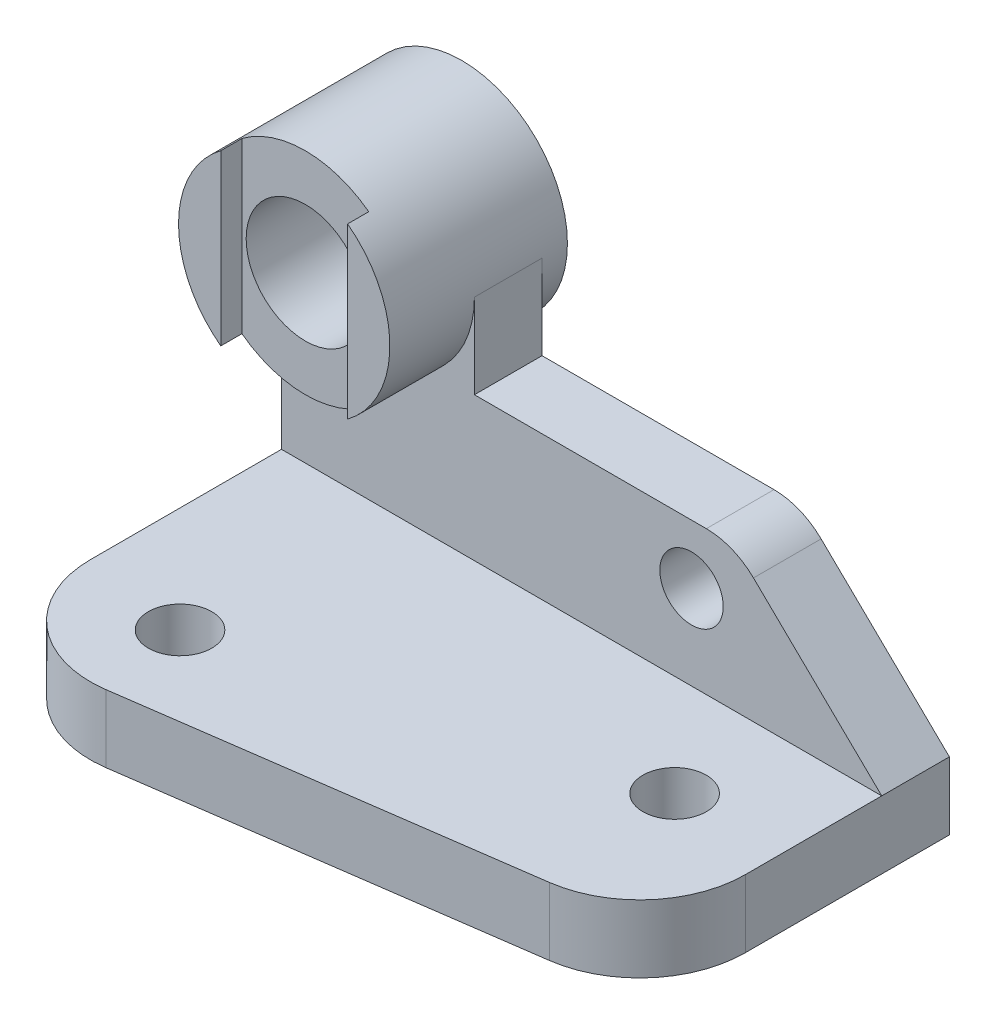
ISO-10303-21;
HEADER;
FILE_DESCRIPTION(('STEP AP214'),'2;1');
FILE_NAME('part.step','',(''),(''),'','','');
FILE_SCHEMA(('AUTOMOTIVE_DESIGN { 1 0 10303 214 1 1 1 1 }'));
ENDSEC;
DATA;
#1=APPLICATION_CONTEXT('core data for automotive mechanical design processes');
#2=APPLICATION_PROTOCOL_DEFINITION('international standard','automotive_design',2000,#1);
#3=PRODUCT_CONTEXT('',#1,'mechanical');
#4=PRODUCT('Part','Part','',(#3));
#5=PRODUCT_RELATED_PRODUCT_CATEGORY('part','',(#4));
#6=PRODUCT_DEFINITION_FORMATION('','',#4);
#7=PRODUCT_DEFINITION_CONTEXT('part definition',#1,'design');
#8=PRODUCT_DEFINITION('design','',#6,#7);
#9=PRODUCT_DEFINITION_SHAPE('','',#8);
#10=(LENGTH_UNIT() NAMED_UNIT(*) SI_UNIT(.MILLI.,.METRE.));
#11=(NAMED_UNIT(*) PLANE_ANGLE_UNIT() SI_UNIT($,.RADIAN.));
#12=(NAMED_UNIT(*) SI_UNIT($,.STERADIAN.) SOLID_ANGLE_UNIT());
#13=UNCERTAINTY_MEASURE_WITH_UNIT(LENGTH_MEASURE(1.E-05),#10,'distance_accuracy_value','');
#14=(GEOMETRIC_REPRESENTATION_CONTEXT(3) GLOBAL_UNCERTAINTY_ASSIGNED_CONTEXT((#13)) GLOBAL_UNIT_ASSIGNED_CONTEXT((#10,
#11,#12)) REPRESENTATION_CONTEXT('',''));
#15=CARTESIAN_POINT('',(0.,0.,0.));
#16=DIRECTION('',(0.,0.,1.));
#17=DIRECTION('',(1.,0.,0.));
#18=AXIS2_PLACEMENT_3D('',#15,#16,#17);
#19=CARTESIAN_POINT('',(20.64,70.,36.));
#20=DIRECTION('',(0.,0.,-1.));
#21=DIRECTION('',(-1.,0.,0.));
#22=AXIS2_PLACEMENT_3D('',#19,#20,#21);
#23=PLANE('',#22);
#24=CARTESIAN_POINT('',(20.64,70.,36.));
#25=DIRECTION('',(0.,0.,-1.));
#26=DIRECTION('',(-1.,0.,0.));
#27=AXIS2_PLACEMENT_3D('',#24,#25,#26);
#28=CIRCLE('',#27,25.);
#29=CARTESIAN_POINT('',(35.64,90.,36.));
#30=VERTEX_POINT('',#29);
#31=CARTESIAN_POINT('',(35.64,50.,36.));
#32=VERTEX_POINT('',#31);
#33=EDGE_CURVE('E162',#30,#32,#28,.T.);
#34=ORIENTED_EDGE('',*,*,#33,.F.);
#35=DIRECTION('',(0.,1.,0.));
#36=VECTOR('',#35,1.);
#37=CARTESIAN_POINT('',(35.64,100.,36.));
#38=LINE('',#37,#36);
#39=EDGE_CURVE('E150',#32,#30,#38,.T.);
#40=ORIENTED_EDGE('',*,*,#39,.F.);
#41=EDGE_LOOP('',(#34,#40));
#42=FACE_BOUND('',#41,.T.);
#43=ADVANCED_FACE('F35',(#42),#23,.F.);
#44=CARTESIAN_POINT('',(20.64,70.,36.));
#45=DIRECTION('',(0.,0.,-1.));
#46=DIRECTION('',(-1.,0.,0.));
#47=AXIS2_PLACEMENT_3D('',#44,#45,#46);
#48=CYLINDRICAL_SURFACE('',#47,14.);
#49=CARTESIAN_POINT('',(20.64,70.,-6.));
#50=DIRECTION('',(0.,0.,-1.));
#51=DIRECTION('',(-1.,0.,0.));
#52=AXIS2_PLACEMENT_3D('',#49,#50,#51);
#53=CIRCLE('',#52,14.);
#54=CARTESIAN_POINT('',(6.64,70.,-6.));
#55=VERTEX_POINT('',#54);
#56=EDGE_CURVE('E366',#55,#55,#53,.T.);
#57=ORIENTED_EDGE('',*,*,#56,.T.);
#58=EDGE_LOOP('',(#57));
#59=FACE_BOUND('',#58,.T.);
#60=CARTESIAN_POINT('',(20.64,70.,31.));
#61=DIRECTION('',(0.,0.,1.));
#62=DIRECTION('',(1.,0.,0.));
#63=AXIS2_PLACEMENT_3D('',#60,#61,#62);
#64=CIRCLE('',#63,14.);
#65=CARTESIAN_POINT('',(34.64,70.,31.));
#66=VERTEX_POINT('',#65);
#67=EDGE_CURVE('E39',#66,#66,#64,.F.);
#68=ORIENTED_EDGE('',*,*,#67,.F.);
#69=EDGE_LOOP('',(#68));
#70=FACE_BOUND('',#69,.T.);
#71=ADVANCED_FACE('F331',(#59,#70),#48,.F.);
#72=CARTESIAN_POINT('',(0.,16.,0.));
#73=DIRECTION('',(0.,-1.,0.));
#74=DIRECTION('',(0.,0.,-1.));
#75=AXIS2_PLACEMENT_3D('',#72,#73,#74);
#76=PLANE('',#75);
#77=CARTESIAN_POINT('',(25.,16.,65.));
#78=DIRECTION('',(0.,1.,0.));
#79=DIRECTION('',(0.,0.,1.));
#80=AXIS2_PLACEMENT_3D('',#77,#78,#79);
#81=CIRCLE('',#80,7.5);
#82=CARTESIAN_POINT('',(25.,16.,72.5));
#83=VERTEX_POINT('',#82);
#84=EDGE_CURVE('E223',#83,#83,#81,.T.);
#85=ORIENTED_EDGE('',*,*,#84,.F.);
#86=EDGE_LOOP('',(#85));
#87=FACE_BOUND('',#86,.T.);
#88=CARTESIAN_POINT('',(117.,16.,40.));
#89=DIRECTION('',(0.,1.,0.));
#90=DIRECTION('',(0.,0.,1.));
#91=AXIS2_PLACEMENT_3D('',#88,#89,#90);
#92=CIRCLE('',#91,7.50000000000001);
#93=CARTESIAN_POINT('',(117.,16.,47.5));
#94=VERTEX_POINT('',#93);
#95=EDGE_CURVE('E219',#94,#94,#92,.T.);
#96=ORIENTED_EDGE('',*,*,#95,.F.);
#97=EDGE_LOOP('',(#96));
#98=FACE_BOUND('',#97,.T.);
#99=DIRECTION('',(1.,0.,0.));
#100=VECTOR('',#99,1.);
#101=CARTESIAN_POINT('',(142.,16.,16.));
#102=LINE('',#101,#100);
#103=CARTESIAN_POINT('',(0.,16.,16.));
#104=VERTEX_POINT('',#103);
#105=CARTESIAN_POINT('',(142.,16.,16.));
#106=VERTEX_POINT('',#105);
#107=EDGE_CURVE('E59',#104,#106,#102,.T.);
#108=ORIENTED_EDGE('',*,*,#107,.F.);
#109=DIRECTION('',(0.,0.,1.));
#110=VECTOR('',#109,1.);
#111=CARTESIAN_POINT('',(0.,16.,90.));
#112=LINE('',#111,#110);
#113=CARTESIAN_POINT('',(0.,16.,61.2321242672629));
#114=VERTEX_POINT('',#113);
#115=EDGE_CURVE('E232',#104,#114,#112,.T.);
#116=ORIENTED_EDGE('',*,*,#115,.T.);
#117=CARTESIAN_POINT('',(25.,16.,61.2321242672629));
#118=DIRECTION('',(0.,-1.,0.));
#119=DIRECTION('',(0.,0.,-1.));
#120=AXIS2_PLACEMENT_3D('',#117,#118,#119);
#121=CIRCLE('',#120,25.);
#122=CARTESIAN_POINT('',(28.4867130461473,16.,85.9877868949088));
#123=VERTEX_POINT('',#122);
#124=EDGE_CURVE('E266',#114,#123,#121,.F.);
#125=ORIENTED_EDGE('',*,*,#124,.T.);
#126=DIRECTION('',(0.990226505105838,0.,-0.139468521845893));
#127=VECTOR('',#126,1.);
#128=CARTESIAN_POINT('',(142.,16.,70.));
#129=LINE('',#128,#127);
#130=CARTESIAN_POINT('',(120.486713046147,16.,73.0300404160356));
#131=VERTEX_POINT('',#130);
#132=EDGE_CURVE('E234',#123,#131,#129,.T.);
#133=ORIENTED_EDGE('',*,*,#132,.T.);
#134=CARTESIAN_POINT('',(117.,16.,48.2743777883896));
#135=DIRECTION('',(0.,-1.,0.));
#136=DIRECTION('',(0.,0.,-1.));
#137=AXIS2_PLACEMENT_3D('',#134,#135,#136);
#138=CIRCLE('',#137,25.);
#139=CARTESIAN_POINT('',(142.,16.,48.2743777883896));
#140=VERTEX_POINT('',#139);
#141=EDGE_CURVE('E44',#131,#140,#138,.F.);
#142=ORIENTED_EDGE('',*,*,#141,.T.);
#143=DIRECTION('',(0.,0.,-1.));
#144=VECTOR('',#143,1.);
#145=CARTESIAN_POINT('',(142.,16.,0.));
#146=LINE('',#145,#144);
#147=EDGE_CURVE('E238',#140,#106,#146,.T.);
#148=ORIENTED_EDGE('',*,*,#147,.T.);
#149=EDGE_LOOP('',(#108,#116,#125,#133,#142,#148));
#150=FACE_BOUND('',#149,.T.);
#151=ADVANCED_FACE('F270',(#87,#98,#150),#76,.F.);
#152=CARTESIAN_POINT('',(0.,16.,90.));
#153=DIRECTION('',(1.,0.,0.));
#154=DIRECTION('',(0.,0.,-1.));
#155=AXIS2_PLACEMENT_3D('',#152,#153,#154);
#156=PLANE('',#155);
#157=DIRECTION('',(0.,0.,1.));
#158=VECTOR('',#157,1.);
#159=CARTESIAN_POINT('',(0.,0.,90.));
#160=LINE('',#159,#158);
#161=CARTESIAN_POINT('',(0.,0.,0.));
#162=VERTEX_POINT('',#161);
#163=CARTESIAN_POINT('',(0.,0.,61.2321242672629));
#164=VERTEX_POINT('',#163);
#165=EDGE_CURVE('E229',#162,#164,#160,.T.);
#166=ORIENTED_EDGE('',*,*,#165,.T.);
#167=DIRECTION('',(0.,-1.,0.));
#168=VECTOR('',#167,1.);
#169=CARTESIAN_POINT('',(0.,16.,61.2321242672629));
#170=LINE('',#169,#168);
#171=EDGE_CURVE('E11',#164,#114,#170,.F.);
#172=ORIENTED_EDGE('',*,*,#171,.T.);
#173=ORIENTED_EDGE('',*,*,#115,.F.);
#174=DIRECTION('',(0.,-1.,0.));
#175=VECTOR('',#174,1.);
#176=CARTESIAN_POINT('',(0.,16.,16.));
#177=LINE('',#176,#175);
#178=CARTESIAN_POINT('',(0.,55.8936042874163,16.));
#179=VERTEX_POINT('',#178);
#180=EDGE_CURVE('E192',#179,#104,#177,.T.);
#181=ORIENTED_EDGE('',*,*,#180,.F.);
#182=DIRECTION('',(0.,0.,-1.));
#183=VECTOR('',#182,1.);
#184=CARTESIAN_POINT('',(0.,55.8936042874163,16.));
#185=LINE('',#184,#183);
#186=CARTESIAN_POINT('',(0.,55.8936042874163,0.));
#187=VERTEX_POINT('',#186);
#188=EDGE_CURVE('E194',#179,#187,#185,.T.);
#189=ORIENTED_EDGE('',*,*,#188,.T.);
#190=DIRECTION('',(0.,-1.,0.));
#191=VECTOR('',#190,1.);
#192=CARTESIAN_POINT('',(0.,16.,0.));
#193=LINE('',#192,#191);
#194=EDGE_CURVE('E240',#187,#162,#193,.T.);
#195=ORIENTED_EDGE('',*,*,#194,.T.);
#196=EDGE_LOOP('',(#166,#172,#173,#181,#189,#195));
#197=FACE_BOUND('',#196,.T.);
#198=ADVANCED_FACE('F293',(#197),#156,.F.);
#199=CARTESIAN_POINT('',(142.,16.,70.));
#200=DIRECTION('',(-0.139468521845893,0.,-0.990226505105838));
#201=DIRECTION('',(-0.990226505105838,0.,0.139468521845893));
#202=AXIS2_PLACEMENT_3D('',#199,#200,#201);
#203=PLANE('',#202);
#204=DIRECTION('',(0.990226505105838,0.,-0.139468521845893));
#205=VECTOR('',#204,1.);
#206=CARTESIAN_POINT('',(142.,0.,70.));
#207=LINE('',#206,#205);
#208=CARTESIAN_POINT('',(28.4867130461473,0.,85.9877868949088));
#209=VERTEX_POINT('',#208);
#210=CARTESIAN_POINT('',(120.486713046147,0.,73.0300404160356));
#211=VERTEX_POINT('',#210);
#212=EDGE_CURVE('E243',#209,#211,#207,.T.);
#213=ORIENTED_EDGE('',*,*,#212,.T.);
#214=DIRECTION('',(0.,-1.,0.));
#215=VECTOR('',#214,1.);
#216=CARTESIAN_POINT('',(120.486713046147,16.,73.0300404160356));
#217=LINE('',#216,#215);
#218=EDGE_CURVE('E264',#211,#131,#217,.F.);
#219=ORIENTED_EDGE('',*,*,#218,.T.);
#220=ORIENTED_EDGE('',*,*,#132,.F.);
#221=DIRECTION('',(0.,-1.,0.));
#222=VECTOR('',#221,1.);
#223=CARTESIAN_POINT('',(28.4867130461473,16.,85.9877868949088));
#224=LINE('',#223,#222);
#225=EDGE_CURVE('E261',#123,#209,#224,.T.);
#226=ORIENTED_EDGE('',*,*,#225,.T.);
#227=EDGE_LOOP('',(#213,#219,#220,#226));
#228=FACE_BOUND('',#227,.T.);
#229=ADVANCED_FACE('F286',(#228),#203,.F.);
#230=CARTESIAN_POINT('',(142.,16.,0.));
#231=DIRECTION('',(-1.,0.,0.));
#232=DIRECTION('',(0.,0.,1.));
#233=AXIS2_PLACEMENT_3D('',#230,#231,#232);
#234=PLANE('',#233);
#235=ORIENTED_EDGE('',*,*,#147,.F.);
#236=DIRECTION('',(0.,-1.,0.));
#237=VECTOR('',#236,1.);
#238=CARTESIAN_POINT('',(142.,16.,48.2743777883896));
#239=LINE('',#238,#237);
#240=CARTESIAN_POINT('',(142.,0.,48.2743777883896));
#241=VERTEX_POINT('',#240);
#242=EDGE_CURVE('E254',#140,#241,#239,.T.);
#243=ORIENTED_EDGE('',*,*,#242,.T.);
#244=DIRECTION('',(0.,0.,-1.));
#245=VECTOR('',#244,1.);
#246=CARTESIAN_POINT('',(142.,0.,0.));
#247=LINE('',#246,#245);
#248=CARTESIAN_POINT('',(142.,0.,0.));
#249=VERTEX_POINT('',#248);
#250=EDGE_CURVE('E246',#241,#249,#247,.T.);
#251=ORIENTED_EDGE('',*,*,#250,.T.);
#252=DIRECTION('',(0.,-1.,0.));
#253=VECTOR('',#252,1.);
#254=CARTESIAN_POINT('',(142.,16.,0.));
#255=LINE('',#254,#253);
#256=CARTESIAN_POINT('',(142.,16.,0.));
#257=VERTEX_POINT('',#256);
#258=EDGE_CURVE('E251',#257,#249,#255,.T.);
#259=ORIENTED_EDGE('',*,*,#258,.F.);
#260=DIRECTION('',(0.,0.,-1.));
#261=VECTOR('',#260,1.);
#262=CARTESIAN_POINT('',(142.,16.,16.));
#263=LINE('',#262,#261);
#264=EDGE_CURVE('E216',#106,#257,#263,.T.);
#265=ORIENTED_EDGE('',*,*,#264,.F.);
#266=EDGE_LOOP('',(#235,#243,#251,#259,#265));
#267=FACE_BOUND('',#266,.T.);
#268=ADVANCED_FACE('F277',(#267),#234,.F.);
#269=CARTESIAN_POINT('',(0.,16.,0.));
#270=DIRECTION('',(0.,0.,1.));
#271=DIRECTION('',(1.,0.,0.));
#272=AXIS2_PLACEMENT_3D('',#269,#270,#271);
#273=PLANE('',#272);
#274=CARTESIAN_POINT('',(97.,36.,0.));
#275=DIRECTION('',(0.,0.,1.));
#276=DIRECTION('',(1.,0.,0.));
#277=AXIS2_PLACEMENT_3D('',#274,#275,#276);
#278=CIRCLE('',#277,7.5);
#279=CARTESIAN_POINT('',(104.5,36.,0.));
#280=VERTEX_POINT('',#279);
#281=EDGE_CURVE('E364',#280,#280,#278,.T.);
#282=ORIENTED_EDGE('',*,*,#281,.T.);
#283=EDGE_LOOP('',(#282));
#284=FACE_BOUND('',#283,.T.);
#285=DIRECTION('',(-1.,0.,0.));
#286=VECTOR('',#285,1.);
#287=CARTESIAN_POINT('',(0.,0.,0.));
#288=LINE('',#287,#286);
#289=EDGE_CURVE('E235',#249,#162,#288,.T.);
#290=ORIENTED_EDGE('',*,*,#289,.T.);
#291=ORIENTED_EDGE('',*,*,#194,.F.);
#292=CARTESIAN_POINT('',(20.64,70.,0.));
#293=DIRECTION('',(0.,0.,-1.));
#294=DIRECTION('',(1.,0.,0.));
#295=AXIS2_PLACEMENT_3D('',#292,#293,#294);
#296=CIRCLE('',#295,25.);
#297=CARTESIAN_POINT('',(45.64,70.,0.));
#298=VERTEX_POINT('',#297);
#299=EDGE_CURVE('E180',#298,#187,#296,.T.);
#300=ORIENTED_EDGE('',*,*,#299,.F.);
#301=DIRECTION('',(0.,1.,0.));
#302=VECTOR('',#301,1.);
#303=CARTESIAN_POINT('',(45.64,50.,0.));
#304=LINE('',#303,#302);
#305=CARTESIAN_POINT('',(45.64,50.,0.));
#306=VERTEX_POINT('',#305);
#307=EDGE_CURVE('E199',#306,#298,#304,.T.);
#308=ORIENTED_EDGE('',*,*,#307,.F.);
#309=DIRECTION('',(-1.,0.,0.));
#310=VECTOR('',#309,1.);
#311=CARTESIAN_POINT('',(100.508003955283,50.,0.));
#312=LINE('',#311,#310);
#313=CARTESIAN_POINT('',(100.508003955283,50.,0.));
#314=VERTEX_POINT('',#313);
#315=EDGE_CURVE('E197',#314,#306,#312,.T.);
#316=ORIENTED_EDGE('',*,*,#315,.F.);
#317=CARTESIAN_POINT('',(100.508003955283,34.,0.));
#318=DIRECTION('',(0.,0.,1.));
#319=DIRECTION('',(1.,0.,0.));
#320=AXIS2_PLACEMENT_3D('',#317,#318,#319);
#321=CIRCLE('',#320,16.);
#322=CARTESIAN_POINT('',(111.656574903495,45.4764700937476,0.));
#323=VERTEX_POINT('',#322);
#324=EDGE_CURVE('E171',#323,#314,#321,.T.);
#325=ORIENTED_EDGE('',*,*,#324,.F.);
#326=DIRECTION('',(-0.717279380859227,0.696785684263249,0.));
#327=VECTOR('',#326,1.);
#328=CARTESIAN_POINT('',(142.,16.,0.));
#329=LINE('',#328,#327);
#330=EDGE_CURVE('E168',#257,#323,#329,.T.);
#331=ORIENTED_EDGE('',*,*,#330,.F.);
#332=ORIENTED_EDGE('',*,*,#258,.T.);
#333=EDGE_LOOP('',(#290,#291,#300,#308,#316,#325,#331,#332));
#334=FACE_BOUND('',#333,.T.);
#335=ADVANCED_FACE('F298',(#284,#334),#273,.F.);
#336=CARTESIAN_POINT('',(0.,0.,0.));
#337=DIRECTION('',(0.,-1.,0.));
#338=DIRECTION('',(0.,0.,-1.));
#339=AXIS2_PLACEMENT_3D('',#336,#337,#338);
#340=PLANE('',#339);
#341=CARTESIAN_POINT('',(117.,0.,40.));
#342=DIRECTION('',(0.,1.,0.));
#343=DIRECTION('',(0.,0.,1.));
#344=AXIS2_PLACEMENT_3D('',#341,#342,#343);
#345=CIRCLE('',#344,7.50000000000001);
#346=CARTESIAN_POINT('',(117.,0.,47.5));
#347=VERTEX_POINT('',#346);
#348=EDGE_CURVE('E220',#347,#347,#345,.T.);
#349=ORIENTED_EDGE('',*,*,#348,.T.);
#350=EDGE_LOOP('',(#349));
#351=FACE_BOUND('',#350,.T.);
#352=CARTESIAN_POINT('',(25.,0.,65.));
#353=DIRECTION('',(0.,1.,0.));
#354=DIRECTION('',(0.,0.,1.));
#355=AXIS2_PLACEMENT_3D('',#352,#353,#354);
#356=CIRCLE('',#355,7.5);
#357=CARTESIAN_POINT('',(25.,0.,72.5));
#358=VERTEX_POINT('',#357);
#359=EDGE_CURVE('E226',#358,#358,#356,.T.);
#360=ORIENTED_EDGE('',*,*,#359,.T.);
#361=EDGE_LOOP('',(#360));
#362=FACE_BOUND('',#361,.T.);
#363=ORIENTED_EDGE('',*,*,#250,.F.);
#364=CARTESIAN_POINT('',(117.,0.,48.2743777883896));
#365=DIRECTION('',(0.,-1.,0.));
#366=DIRECTION('',(0.,0.,-1.));
#367=AXIS2_PLACEMENT_3D('',#364,#365,#366);
#368=CIRCLE('',#367,25.);
#369=EDGE_CURVE('E259',#241,#211,#368,.T.);
#370=ORIENTED_EDGE('',*,*,#369,.T.);
#371=ORIENTED_EDGE('',*,*,#212,.F.);
#372=CARTESIAN_POINT('',(25.,0.,61.2321242672629));
#373=DIRECTION('',(0.,-1.,0.));
#374=DIRECTION('',(0.,0.,-1.));
#375=AXIS2_PLACEMENT_3D('',#372,#373,#374);
#376=CIRCLE('',#375,25.);
#377=EDGE_CURVE('E257',#209,#164,#376,.T.);
#378=ORIENTED_EDGE('',*,*,#377,.T.);
#379=ORIENTED_EDGE('',*,*,#165,.F.);
#380=ORIENTED_EDGE('',*,*,#289,.F.);
#381=EDGE_LOOP('',(#363,#370,#371,#378,#379,#380));
#382=FACE_BOUND('',#381,.T.);
#383=ADVANCED_FACE('F283',(#351,#362,#382),#340,.T.);
#384=CARTESIAN_POINT('',(117.,16.,48.2743777883896));
#385=DIRECTION('',(0.,-1.,0.));
#386=DIRECTION('',(0.,0.,-1.));
#387=AXIS2_PLACEMENT_3D('',#384,#385,#386);
#388=CYLINDRICAL_SURFACE('',#387,25.);
#389=ORIENTED_EDGE('',*,*,#141,.F.);
#390=ORIENTED_EDGE('',*,*,#218,.F.);
#391=ORIENTED_EDGE('',*,*,#369,.F.);
#392=ORIENTED_EDGE('',*,*,#242,.F.);
#393=EDGE_LOOP('',(#389,#390,#391,#392));
#394=FACE_BOUND('',#393,.T.);
#395=ADVANCED_FACE('F280',(#394),#388,.T.);
#396=CARTESIAN_POINT('',(25.,16.,61.2321242672629));
#397=DIRECTION('',(0.,-1.,0.));
#398=DIRECTION('',(0.,0.,-1.));
#399=AXIS2_PLACEMENT_3D('',#396,#397,#398);
#400=CYLINDRICAL_SURFACE('',#399,25.);
#401=ORIENTED_EDGE('',*,*,#124,.F.);
#402=ORIENTED_EDGE('',*,*,#171,.F.);
#403=ORIENTED_EDGE('',*,*,#377,.F.);
#404=ORIENTED_EDGE('',*,*,#225,.F.);
#405=EDGE_LOOP('',(#401,#402,#403,#404));
#406=FACE_BOUND('',#405,.T.);
#407=ADVANCED_FACE('F37',(#406),#400,.T.);
#408=CARTESIAN_POINT('',(25.,0.,65.));
#409=DIRECTION('',(0.,1.,0.));
#410=DIRECTION('',(0.,0.,1.));
#411=AXIS2_PLACEMENT_3D('',#408,#409,#410);
#412=CYLINDRICAL_SURFACE('',#411,7.5);
#413=ORIENTED_EDGE('',*,*,#359,.F.);
#414=EDGE_LOOP('',(#413));
#415=FACE_BOUND('',#414,.T.);
#416=ORIENTED_EDGE('',*,*,#84,.T.);
#417=EDGE_LOOP('',(#416));
#418=FACE_BOUND('',#417,.T.);
#419=ADVANCED_FACE('F417',(#415,#418),#412,.F.);
#420=CARTESIAN_POINT('',(117.,0.,40.));
#421=DIRECTION('',(0.,1.,0.));
#422=DIRECTION('',(0.,0.,1.));
#423=AXIS2_PLACEMENT_3D('',#420,#421,#422);
#424=CYLINDRICAL_SURFACE('',#423,7.50000000000001);
#425=ORIENTED_EDGE('',*,*,#348,.F.);
#426=EDGE_LOOP('',(#425));
#427=FACE_BOUND('',#426,.T.);
#428=ORIENTED_EDGE('',*,*,#95,.T.);
#429=EDGE_LOOP('',(#428));
#430=FACE_BOUND('',#429,.T.);
#431=ADVANCED_FACE('F328',(#427,#430),#424,.F.);
#432=CARTESIAN_POINT('',(142.,16.,16.));
#433=DIRECTION('',(-0.696785684263249,-0.717279380859227,0.));
#434=DIRECTION('',(0.717279380859227,-0.696785684263249,0.));
#435=AXIS2_PLACEMENT_3D('',#432,#433,#434);
#436=PLANE('',#435);
#437=ORIENTED_EDGE('',*,*,#330,.T.);
#438=DIRECTION('',(0.,0.,-1.));
#439=VECTOR('',#438,1.);
#440=CARTESIAN_POINT('',(111.656574903495,45.4764700937476,16.));
#441=LINE('',#440,#439);
#442=CARTESIAN_POINT('',(111.656574903495,45.4764700937476,16.));
#443=VERTEX_POINT('',#442);
#444=EDGE_CURVE('E213',#443,#323,#441,.T.);
#445=ORIENTED_EDGE('',*,*,#444,.F.);
#446=DIRECTION('',(-0.717279380859227,0.696785684263249,0.));
#447=VECTOR('',#446,1.);
#448=CARTESIAN_POINT('',(142.,16.,16.));
#449=LINE('',#448,#447);
#450=EDGE_CURVE('E179',#106,#443,#449,.T.);
#451=ORIENTED_EDGE('',*,*,#450,.F.);
#452=ORIENTED_EDGE('',*,*,#264,.T.);
#453=EDGE_LOOP('',(#437,#445,#451,#452));
#454=FACE_BOUND('',#453,.T.);
#455=ADVANCED_FACE('F305',(#454),#436,.F.);
#456=CARTESIAN_POINT('',(100.508003955283,34.,16.));
#457=DIRECTION('',(0.,0.,-1.));
#458=DIRECTION('',(-1.,0.,0.));
#459=AXIS2_PLACEMENT_3D('',#456,#457,#458);
#460=CYLINDRICAL_SURFACE('',#459,16.);
#461=ORIENTED_EDGE('',*,*,#324,.T.);
#462=DIRECTION('',(0.,0.,-1.));
#463=VECTOR('',#462,1.);
#464=CARTESIAN_POINT('',(100.508003955283,50.,16.));
#465=LINE('',#464,#463);
#466=CARTESIAN_POINT('',(100.508003955283,50.,16.));
#467=VERTEX_POINT('',#466);
#468=EDGE_CURVE('E210',#467,#314,#465,.T.);
#469=ORIENTED_EDGE('',*,*,#468,.F.);
#470=CARTESIAN_POINT('',(100.508003955283,34.,16.));
#471=DIRECTION('',(0.,0.,1.));
#472=DIRECTION('',(1.,0.,0.));
#473=AXIS2_PLACEMENT_3D('',#470,#471,#472);
#474=CIRCLE('',#473,16.);
#475=EDGE_CURVE('E182',#443,#467,#474,.T.);
#476=ORIENTED_EDGE('',*,*,#475,.F.);
#477=ORIENTED_EDGE('',*,*,#444,.T.);
#478=EDGE_LOOP('',(#461,#469,#476,#477));
#479=FACE_BOUND('',#478,.T.);
#480=ADVANCED_FACE('F320',(#479),#460,.T.);
#481=CARTESIAN_POINT('',(100.508003955283,50.,16.));
#482=DIRECTION('',(0.,-1.,0.));
#483=DIRECTION('',(1.,0.,0.));
#484=AXIS2_PLACEMENT_3D('',#481,#482,#483);
#485=PLANE('',#484);
#486=ORIENTED_EDGE('',*,*,#315,.T.);
#487=DIRECTION('',(0.,0.,-1.));
#488=VECTOR('',#487,1.);
#489=CARTESIAN_POINT('',(45.64,50.,16.));
#490=LINE('',#489,#488);
#491=CARTESIAN_POINT('',(45.64,50.,16.));
#492=VERTEX_POINT('',#491);
#493=EDGE_CURVE('E207',#492,#306,#490,.T.);
#494=ORIENTED_EDGE('',*,*,#493,.F.);
#495=DIRECTION('',(-1.,0.,0.));
#496=VECTOR('',#495,1.);
#497=CARTESIAN_POINT('',(100.508003955283,50.,16.));
#498=LINE('',#497,#496);
#499=EDGE_CURVE('E184',#467,#492,#498,.T.);
#500=ORIENTED_EDGE('',*,*,#499,.F.);
#501=ORIENTED_EDGE('',*,*,#468,.T.);
#502=EDGE_LOOP('',(#486,#494,#500,#501));
#503=FACE_BOUND('',#502,.T.);
#504=ADVANCED_FACE('F316',(#503),#485,.F.);
#505=CARTESIAN_POINT('',(45.64,50.,16.));
#506=DIRECTION('',(-1.,0.,0.));
#507=DIRECTION('',(0.,0.,1.));
#508=AXIS2_PLACEMENT_3D('',#505,#506,#507);
#509=PLANE('',#508);
#510=ORIENTED_EDGE('',*,*,#307,.T.);
#511=DIRECTION('',(0.,0.,-1.));
#512=VECTOR('',#511,1.);
#513=CARTESIAN_POINT('',(45.64,70.,16.));
#514=LINE('',#513,#512);
#515=CARTESIAN_POINT('',(45.64,70.,16.));
#516=VERTEX_POINT('',#515);
#517=EDGE_CURVE('E205',#516,#298,#514,.T.);
#518=ORIENTED_EDGE('',*,*,#517,.F.);
#519=DIRECTION('',(0.,1.,0.));
#520=VECTOR('',#519,1.);
#521=CARTESIAN_POINT('',(45.64,50.,16.));
#522=LINE('',#521,#520);
#523=EDGE_CURVE('E186',#492,#516,#522,.T.);
#524=ORIENTED_EDGE('',*,*,#523,.F.);
#525=ORIENTED_EDGE('',*,*,#493,.T.);
#526=EDGE_LOOP('',(#510,#518,#524,#525));
#527=FACE_BOUND('',#526,.T.);
#528=ADVANCED_FACE('F313',(#527),#509,.F.);
#529=CARTESIAN_POINT('',(20.64,70.,16.));
#530=DIRECTION('',(0.,0.,1.));
#531=DIRECTION('',(1.,0.,0.));
#532=AXIS2_PLACEMENT_3D('',#529,#530,#531);
#533=PLANE('',#532);
#534=CARTESIAN_POINT('',(97.,36.,16.));
#535=DIRECTION('',(0.,0.,1.));
#536=DIRECTION('',(1.,0.,0.));
#537=AXIS2_PLACEMENT_3D('',#534,#535,#536);
#538=CIRCLE('',#537,7.5);
#539=CARTESIAN_POINT('',(104.5,36.,16.));
#540=VERTEX_POINT('',#539);
#541=EDGE_CURVE('E157',#540,#540,#538,.T.);
#542=ORIENTED_EDGE('',*,*,#541,.F.);
#543=EDGE_LOOP('',(#542));
#544=FACE_BOUND('',#543,.T.);
#545=ORIENTED_EDGE('',*,*,#107,.T.);
#546=ORIENTED_EDGE('',*,*,#450,.T.);
#547=ORIENTED_EDGE('',*,*,#475,.T.);
#548=ORIENTED_EDGE('',*,*,#499,.T.);
#549=ORIENTED_EDGE('',*,*,#523,.T.);
#550=CARTESIAN_POINT('',(20.64,70.,16.));
#551=DIRECTION('',(0.,0.,-1.));
#552=DIRECTION('',(1.,0.,0.));
#553=AXIS2_PLACEMENT_3D('',#550,#551,#552);
#554=CIRCLE('',#553,25.);
#555=EDGE_CURVE('E189',#516,#179,#554,.T.);
#556=ORIENTED_EDGE('',*,*,#555,.T.);
#557=ORIENTED_EDGE('',*,*,#180,.T.);
#558=EDGE_LOOP('',(#545,#546,#547,#548,#549,#556,#557));
#559=FACE_BOUND('',#558,.T.);
#560=ADVANCED_FACE('F308',(#544,#559),#533,.T.);
#561=CARTESIAN_POINT('',(20.64,70.,36.));
#562=DIRECTION('',(0.,0.,-1.));
#563=DIRECTION('',(-1.,0.,0.));
#564=AXIS2_PLACEMENT_3D('',#561,#562,#563);
#565=CYLINDRICAL_SURFACE('',#564,25.);
#566=DIRECTION('',(0.,0.,-1.));
#567=VECTOR('',#566,1.);
#568=CARTESIAN_POINT('',(35.64,50.,36.));
#569=LINE('',#568,#567);
#570=CARTESIAN_POINT('',(35.64,50.,31.));
#571=VERTEX_POINT('',#570);
#572=EDGE_CURVE('E147',#571,#32,#569,.F.);
#573=ORIENTED_EDGE('',*,*,#572,.F.);
#574=CARTESIAN_POINT('',(20.64,70.,31.));
#575=DIRECTION('',(0.,0.,1.));
#576=DIRECTION('',(1.,0.,0.));
#577=AXIS2_PLACEMENT_3D('',#574,#575,#576);
#578=CIRCLE('',#577,25.);
#579=CARTESIAN_POINT('',(5.63999999999999,50.,31.));
#580=VERTEX_POINT('',#579);
#581=EDGE_CURVE('E353',#571,#580,#578,.F.);
#582=ORIENTED_EDGE('',*,*,#581,.T.);
#583=DIRECTION('',(0.,0.,-1.));
#584=VECTOR('',#583,1.);
#585=CARTESIAN_POINT('',(5.63999999999999,50.,36.));
#586=LINE('',#585,#584);
#587=CARTESIAN_POINT('',(5.63999999999999,50.,36.));
#588=VERTEX_POINT('',#587);
#589=EDGE_CURVE('E352',#588,#580,#586,.T.);
#590=ORIENTED_EDGE('',*,*,#589,.F.);
#591=CARTESIAN_POINT('',(5.63999999999999,90.,36.));
#592=VERTEX_POINT('',#591);
#593=EDGE_CURVE('E169',#588,#592,#28,.T.);
#594=ORIENTED_EDGE('',*,*,#593,.T.);
#595=DIRECTION('',(0.,0.,-1.));
#596=VECTOR('',#595,1.);
#597=CARTESIAN_POINT('',(5.63999999999999,90.,36.));
#598=LINE('',#597,#596);
#599=CARTESIAN_POINT('',(5.63999999999999,90.,31.));
#600=VERTEX_POINT('',#599);
#601=EDGE_CURVE('E51',#600,#592,#598,.F.);
#602=ORIENTED_EDGE('',*,*,#601,.F.);
#603=CARTESIAN_POINT('',(35.64,90.,31.));
#604=VERTEX_POINT('',#603);
#605=EDGE_CURVE('E357',#600,#604,#578,.F.);
#606=ORIENTED_EDGE('',*,*,#605,.T.);
#607=DIRECTION('',(0.,0.,-1.));
#608=VECTOR('',#607,1.);
#609=CARTESIAN_POINT('',(35.64,90.,36.));
#610=LINE('',#609,#608);
#611=EDGE_CURVE('E158',#30,#604,#610,.T.);
#612=ORIENTED_EDGE('',*,*,#611,.F.);
#613=ORIENTED_EDGE('',*,*,#33,.T.);
#614=EDGE_LOOP('',(#573,#582,#590,#594,#602,#606,#612,#613));
#615=FACE_BOUND('',#614,.T.);
#616=CARTESIAN_POINT('',(20.64,70.,-6.));
#617=DIRECTION('',(0.,0.,-1.));
#618=DIRECTION('',(-1.,0.,0.));
#619=AXIS2_PLACEMENT_3D('',#616,#617,#618);
#620=CIRCLE('',#619,25.);
#621=CARTESIAN_POINT('',(-4.36000000000001,70.,-6.));
#622=VERTEX_POINT('',#621);
#623=EDGE_CURVE('E174',#622,#622,#620,.T.);
#624=ORIENTED_EDGE('',*,*,#623,.F.);
#625=EDGE_LOOP('',(#624));
#626=FACE_BOUND('',#625,.T.);
#627=ORIENTED_EDGE('',*,*,#188,.F.);
#628=ORIENTED_EDGE('',*,*,#555,.F.);
#629=ORIENTED_EDGE('',*,*,#517,.T.);
#630=ORIENTED_EDGE('',*,*,#299,.T.);
#631=EDGE_LOOP('',(#627,#628,#629,#630));
#632=FACE_BOUND('',#631,.T.);
#633=ADVANCED_FACE('F165',(#615,#626,#632),#565,.T.);
#634=ORIENTED_EDGE('',*,*,#593,.F.);
#635=DIRECTION('',(0.,-1.,0.));
#636=VECTOR('',#635,1.);
#637=CARTESIAN_POINT('',(5.63999999999999,100.,36.));
#638=LINE('',#637,#636);
#639=EDGE_CURVE('E163',#592,#588,#638,.T.);
#640=ORIENTED_EDGE('',*,*,#639,.F.);
#641=EDGE_LOOP('',(#634,#640));
#642=FACE_BOUND('',#641,.T.);
#643=ADVANCED_FACE('F333',(#642),#23,.F.);
#644=CARTESIAN_POINT('',(20.64,70.,-6.));
#645=DIRECTION('',(0.,0.,-1.));
#646=DIRECTION('',(-1.,0.,0.));
#647=AXIS2_PLACEMENT_3D('',#644,#645,#646);
#648=PLANE('',#647);
#649=ORIENTED_EDGE('',*,*,#623,.T.);
#650=EDGE_LOOP('',(#649));
#651=FACE_BOUND('',#650,.T.);
#652=ORIENTED_EDGE('',*,*,#56,.F.);
#653=EDGE_LOOP('',(#652));
#654=FACE_BOUND('',#653,.T.);
#655=ADVANCED_FACE('F341',(#651,#654),#648,.T.);
#656=CARTESIAN_POINT('',(97.,36.,-6.));
#657=DIRECTION('',(0.,0.,1.));
#658=DIRECTION('',(1.,0.,0.));
#659=AXIS2_PLACEMENT_3D('',#656,#657,#658);
#660=CYLINDRICAL_SURFACE('',#659,7.5);
#661=ORIENTED_EDGE('',*,*,#541,.T.);
#662=EDGE_LOOP('',(#661));
#663=FACE_BOUND('',#662,.T.);
#664=ORIENTED_EDGE('',*,*,#281,.F.);
#665=EDGE_LOOP('',(#664));
#666=FACE_BOUND('',#665,.T.);
#667=ADVANCED_FACE('F347',(#663,#666),#660,.F.);
#668=CARTESIAN_POINT('',(0.,0.,31.));
#669=DIRECTION('',(0.,0.,1.));
#670=DIRECTION('',(1.,0.,0.));
#671=AXIS2_PLACEMENT_3D('',#668,#669,#670);
#672=PLANE('',#671);
#673=DIRECTION('',(0.,1.,0.));
#674=VECTOR('',#673,1.);
#675=CARTESIAN_POINT('',(35.64,100.,31.));
#676=LINE('',#675,#674);
#677=EDGE_CURVE('E153',#571,#604,#676,.T.);
#678=ORIENTED_EDGE('',*,*,#677,.T.);
#679=ORIENTED_EDGE('',*,*,#605,.F.);
#680=DIRECTION('',(0.,-1.,0.));
#681=VECTOR('',#680,1.);
#682=CARTESIAN_POINT('',(5.63999999999999,100.,31.));
#683=LINE('',#682,#681);
#684=EDGE_CURVE('E376',#600,#580,#683,.T.);
#685=ORIENTED_EDGE('',*,*,#684,.T.);
#686=ORIENTED_EDGE('',*,*,#581,.F.);
#687=EDGE_LOOP('',(#678,#679,#685,#686));
#688=FACE_BOUND('',#687,.T.);
#689=ORIENTED_EDGE('',*,*,#67,.T.);
#690=EDGE_LOOP('',(#689));
#691=FACE_BOUND('',#690,.T.);
#692=ADVANCED_FACE('F386',(#688,#691),#672,.T.);
#693=CARTESIAN_POINT('',(35.64,100.,31.));
#694=DIRECTION('',(1.,0.,0.));
#695=DIRECTION('',(0.,1.,0.));
#696=AXIS2_PLACEMENT_3D('',#693,#694,#695);
#697=PLANE('',#696);
#698=ORIENTED_EDGE('',*,*,#572,.T.);
#699=ORIENTED_EDGE('',*,*,#39,.T.);
#700=ORIENTED_EDGE('',*,*,#611,.T.);
#701=ORIENTED_EDGE('',*,*,#677,.F.);
#702=EDGE_LOOP('',(#698,#699,#700,#701));
#703=FACE_BOUND('',#702,.T.);
#704=ADVANCED_FACE('F149',(#703),#697,.F.);
#705=CARTESIAN_POINT('',(5.63999999999999,100.,31.));
#706=DIRECTION('',(-1.,0.,0.));
#707=DIRECTION('',(0.,-1.,0.));
#708=AXIS2_PLACEMENT_3D('',#705,#706,#707);
#709=PLANE('',#708);
#710=ORIENTED_EDGE('',*,*,#601,.T.);
#711=ORIENTED_EDGE('',*,*,#639,.T.);
#712=ORIENTED_EDGE('',*,*,#589,.T.);
#713=ORIENTED_EDGE('',*,*,#684,.F.);
#714=EDGE_LOOP('',(#710,#711,#712,#713));
#715=FACE_BOUND('',#714,.T.);
#716=ADVANCED_FACE('F380',(#715),#709,.F.);
#717=CLOSED_SHELL('',(#43,#71,#151,#198,#229,#268,#335,#383,#395,#407,#419,#431,#455,#480,#504,
#528,#560,#633,#643,#655,#667,#692,#704,#716));
#718=MANIFOLD_SOLID_BREP('B2',#717);
#719=ADVANCED_BREP_SHAPE_REPRESENTATION('',(#18,#718),#14);
#720=SHAPE_DEFINITION_REPRESENTATION(#9,#719);
ENDSEC;
END-ISO-10303-21;
